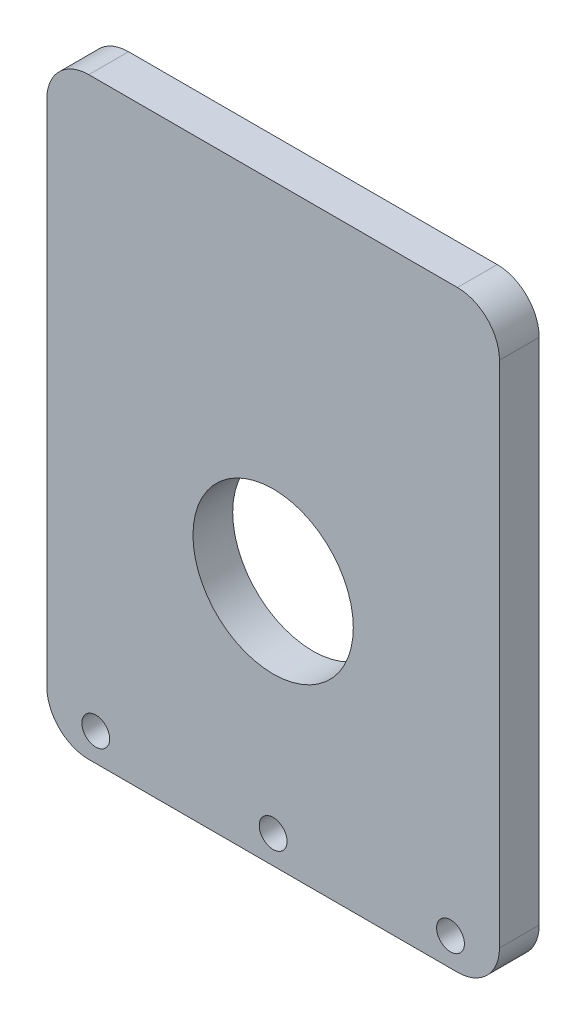
ISO-10303-21;
HEADER;
FILE_DESCRIPTION(('STEP AP214'),'2;1');
FILE_NAME('part.step','',(''),(''),'','','');
FILE_SCHEMA(('AUTOMOTIVE_DESIGN { 1 0 10303 214 1 1 1 1 }'));
ENDSEC;
DATA;
#1=APPLICATION_CONTEXT('core data for automotive mechanical design processes');
#2=APPLICATION_PROTOCOL_DEFINITION('international standard','automotive_design',2000,#1);
#3=PRODUCT_CONTEXT('',#1,'mechanical');
#4=PRODUCT('Part','Part','',(#3));
#5=PRODUCT_RELATED_PRODUCT_CATEGORY('part','',(#4));
#6=PRODUCT_DEFINITION_FORMATION('','',#4);
#7=PRODUCT_DEFINITION_CONTEXT('part definition',#1,'design');
#8=PRODUCT_DEFINITION('design','',#6,#7);
#9=PRODUCT_DEFINITION_SHAPE('','',#8);
#10=(LENGTH_UNIT() NAMED_UNIT(*) SI_UNIT(.MILLI.,.METRE.));
#11=(NAMED_UNIT(*) PLANE_ANGLE_UNIT() SI_UNIT($,.RADIAN.));
#12=(NAMED_UNIT(*) SI_UNIT($,.STERADIAN.) SOLID_ANGLE_UNIT());
#13=UNCERTAINTY_MEASURE_WITH_UNIT(LENGTH_MEASURE(1.E-05),#10,'distance_accuracy_value','');
#14=(GEOMETRIC_REPRESENTATION_CONTEXT(3) GLOBAL_UNCERTAINTY_ASSIGNED_CONTEXT((#13)) GLOBAL_UNIT_ASSIGNED_CONTEXT((#10,
#11,#12)) REPRESENTATION_CONTEXT('',''));
#15=CARTESIAN_POINT('',(0.,0.,0.));
#16=DIRECTION('',(0.,0.,1.));
#17=DIRECTION('',(1.,0.,0.));
#18=AXIS2_PLACEMENT_3D('',#15,#16,#17);
#19=CARTESIAN_POINT('',(-4909.25826633337,2111.96119744792,7.112));
#20=DIRECTION('',(0.,0.,1.));
#21=DIRECTION('',(1.,0.,0.));
#22=AXIS2_PLACEMENT_3D('',#19,#20,#21);
#23=PLANE('',#22);
#24=CARTESIAN_POINT('',(-4908.01366633337,2018.34949744792,7.112));
#25=DIRECTION('',(0.,0.,1.));
#26=DIRECTION('',(1.,0.,0.));
#27=AXIS2_PLACEMENT_3D('',#24,#25,#26);
#28=CIRCLE('',#27,2.4892000000003);
#29=CARTESIAN_POINT('',(-4905.52446633337,2018.34949744792,7.112));
#30=VERTEX_POINT('',#29);
#31=EDGE_CURVE('E189',#30,#30,#28,.T.);
#32=ORIENTED_EDGE('',*,*,#31,.F.);
#33=EDGE_LOOP('',(#32));
#34=FACE_BOUND('',#33,.T.);
#35=CARTESIAN_POINT('',(-4876.26366633337,2018.34949744792,7.112));
#36=DIRECTION('',(0.,0.,1.));
#37=DIRECTION('',(1.,0.,0.));
#38=AXIS2_PLACEMENT_3D('',#35,#36,#37);
#39=CIRCLE('',#38,2.4892000000003);
#40=CARTESIAN_POINT('',(-4873.77446633337,2018.34949744792,7.112));
#41=VERTEX_POINT('',#40);
#42=EDGE_CURVE('E135',#41,#41,#39,.T.);
#43=ORIENTED_EDGE('',*,*,#42,.F.);
#44=EDGE_LOOP('',(#43));
#45=FACE_BOUND('',#44,.T.);
#46=CARTESIAN_POINT('',(-4909.25826633337,2111.96119744792,7.112));
#47=DIRECTION('',(0.,0.,1.));
#48=DIRECTION('',(1.,0.,0.));
#49=AXIS2_PLACEMENT_3D('',#46,#47,#48);
#50=CIRCLE('',#49,7.5183999999997);
#51=CARTESIAN_POINT('',(-4909.25826633337,2119.47959744792,7.112));
#52=VERTEX_POINT('',#51);
#53=CARTESIAN_POINT('',(-4916.77666633337,2111.96119744792,7.112));
#54=VERTEX_POINT('',#53);
#55=EDGE_CURVE('E146',#52,#54,#50,.T.);
#56=ORIENTED_EDGE('',*,*,#55,.T.);
#57=DIRECTION('',(0.,-1.,0.));
#58=VECTOR('',#57,1.);
#59=CARTESIAN_POINT('',(-4916.77666633337,2111.96119744792,7.112));
#60=LINE('',#59,#58);
#61=CARTESIAN_POINT('',(-4916.77666633337,2020.83869744792,7.112));
#62=VERTEX_POINT('',#61);
#63=EDGE_CURVE('E94',#54,#62,#60,.T.);
#64=ORIENTED_EDGE('',*,*,#63,.T.);
#65=CARTESIAN_POINT('',(-4909.25826633337,2020.83869744792,7.112));
#66=DIRECTION('',(0.,0.,1.));
#67=DIRECTION('',(1.,0.,0.));
#68=AXIS2_PLACEMENT_3D('',#65,#66,#67);
#69=CIRCLE('',#68,7.51839999999948);
#70=CARTESIAN_POINT('',(-4909.25826633337,2013.32029744792,7.112));
#71=VERTEX_POINT('',#70);
#72=EDGE_CURVE('E161',#62,#71,#69,.T.);
#73=ORIENTED_EDGE('',*,*,#72,.T.);
#74=DIRECTION('',(1.,0.,0.));
#75=VECTOR('',#74,1.);
#76=CARTESIAN_POINT('',(-4843.26906633337,2013.32029744792,7.112));
#77=LINE('',#76,#75);
#78=CARTESIAN_POINT('',(-4843.26906633337,2013.32029744792,7.112));
#79=VERTEX_POINT('',#78);
#80=EDGE_CURVE('E174',#71,#79,#77,.T.);
#81=ORIENTED_EDGE('',*,*,#80,.T.);
#82=CARTESIAN_POINT('',(-4843.26906633337,2020.83869744792,7.112));
#83=DIRECTION('',(0.,0.,1.));
#84=DIRECTION('',(1.,0.,0.));
#85=AXIS2_PLACEMENT_3D('',#82,#83,#84);
#86=CIRCLE('',#85,7.51839999999948);
#87=CARTESIAN_POINT('',(-4835.75066633337,2020.83869744792,7.112));
#88=VERTEX_POINT('',#87);
#89=EDGE_CURVE('E113',#79,#88,#86,.T.);
#90=ORIENTED_EDGE('',*,*,#89,.T.);
#91=DIRECTION('',(0.,1.,0.));
#92=VECTOR('',#91,1.);
#93=CARTESIAN_POINT('',(-4835.75066633337,2111.96119744792,7.112));
#94=LINE('',#93,#92);
#95=CARTESIAN_POINT('',(-4835.75066633337,2111.96119744792,7.112));
#96=VERTEX_POINT('',#95);
#97=EDGE_CURVE('E107',#88,#96,#94,.T.);
#98=ORIENTED_EDGE('',*,*,#97,.T.);
#99=CARTESIAN_POINT('',(-4843.26906633337,2111.96119744792,7.112));
#100=DIRECTION('',(0.,0.,1.));
#101=DIRECTION('',(1.,0.,0.));
#102=AXIS2_PLACEMENT_3D('',#99,#100,#101);
#103=CIRCLE('',#102,7.5183999999997);
#104=CARTESIAN_POINT('',(-4843.26906633337,2119.47959744792,7.112));
#105=VERTEX_POINT('',#104);
#106=EDGE_CURVE('E111',#96,#105,#103,.T.);
#107=ORIENTED_EDGE('',*,*,#106,.T.);
#108=DIRECTION('',(-1.,0.,0.));
#109=VECTOR('',#108,1.);
#110=CARTESIAN_POINT('',(-4909.25826633337,2119.47959744792,7.112));
#111=LINE('',#110,#109);
#112=EDGE_CURVE('E51',#105,#52,#111,.T.);
#113=ORIENTED_EDGE('',*,*,#112,.T.);
#114=EDGE_LOOP('',(#56,#64,#73,#81,#90,#98,#107,#113));
#115=FACE_BOUND('',#114,.T.);
#116=CARTESIAN_POINT('',(-4844.51366633337,2018.34949744792,7.112));
#117=DIRECTION('',(0.,0.,1.));
#118=DIRECTION('',(1.,0.,0.));
#119=AXIS2_PLACEMENT_3D('',#116,#117,#118);
#120=CIRCLE('',#119,2.4892000000003);
#121=CARTESIAN_POINT('',(-4842.02446633337,2018.34949744792,7.112));
#122=VERTEX_POINT('',#121);
#123=EDGE_CURVE('E183',#122,#122,#120,.T.);
#124=ORIENTED_EDGE('',*,*,#123,.F.);
#125=EDGE_LOOP('',(#124));
#126=FACE_BOUND('',#125,.T.);
#127=CARTESIAN_POINT('',(-4876.26366633337,2057.41469744792,7.112));
#128=DIRECTION('',(0.,0.,1.));
#129=DIRECTION('',(1.,0.,0.));
#130=AXIS2_PLACEMENT_3D('',#127,#128,#129);
#131=CIRCLE('',#130,14.3509999999996);
#132=CARTESIAN_POINT('',(-4861.91266633337,2057.41469744792,7.112));
#133=VERTEX_POINT('',#132);
#134=EDGE_CURVE('E195',#133,#133,#131,.T.);
#135=ORIENTED_EDGE('',*,*,#134,.F.);
#136=EDGE_LOOP('',(#135));
#137=FACE_BOUND('',#136,.T.);
#138=ADVANCED_FACE('F34',(#34,#45,#115,#126,#137),#23,.T.);
#139=CARTESIAN_POINT('',(-4909.25826633337,2111.96119744792,0.));
#140=DIRECTION('',(0.,0.,1.));
#141=DIRECTION('',(1.,0.,0.));
#142=AXIS2_PLACEMENT_3D('',#139,#140,#141);
#143=PLANE('',#142);
#144=CARTESIAN_POINT('',(-4908.01366633337,2018.34949744792,0.));
#145=DIRECTION('',(0.,0.,1.));
#146=DIRECTION('',(1.,0.,0.));
#147=AXIS2_PLACEMENT_3D('',#144,#145,#146);
#148=CIRCLE('',#147,2.4892000000003);
#149=CARTESIAN_POINT('',(-4905.52446633337,2018.34949744792,0.));
#150=VERTEX_POINT('',#149);
#151=EDGE_CURVE('E192',#150,#150,#148,.T.);
#152=ORIENTED_EDGE('',*,*,#151,.T.);
#153=EDGE_LOOP('',(#152));
#154=FACE_BOUND('',#153,.T.);
#155=CARTESIAN_POINT('',(-4876.26366633337,2018.34949744792,0.));
#156=DIRECTION('',(0.,0.,1.));
#157=DIRECTION('',(1.,0.,0.));
#158=AXIS2_PLACEMENT_3D('',#155,#156,#157);
#159=CIRCLE('',#158,2.4892000000003);
#160=CARTESIAN_POINT('',(-4873.77446633337,2018.34949744792,0.));
#161=VERTEX_POINT('',#160);
#162=EDGE_CURVE('E180',#161,#161,#159,.T.);
#163=ORIENTED_EDGE('',*,*,#162,.T.);
#164=EDGE_LOOP('',(#163));
#165=FACE_BOUND('',#164,.T.);
#166=CARTESIAN_POINT('',(-4909.25826633337,2111.96119744792,0.));
#167=DIRECTION('',(0.,0.,1.));
#168=DIRECTION('',(1.,0.,0.));
#169=AXIS2_PLACEMENT_3D('',#166,#167,#168);
#170=CIRCLE('',#169,7.5183999999997);
#171=CARTESIAN_POINT('',(-4909.25826633337,2119.47959744792,0.));
#172=VERTEX_POINT('',#171);
#173=CARTESIAN_POINT('',(-4916.77666633337,2111.96119744792,0.));
#174=VERTEX_POINT('',#173);
#175=EDGE_CURVE('E131',#172,#174,#170,.T.);
#176=ORIENTED_EDGE('',*,*,#175,.F.);
#177=DIRECTION('',(-1.,0.,0.));
#178=VECTOR('',#177,1.);
#179=CARTESIAN_POINT('',(-4909.25826633337,2119.47959744792,0.));
#180=LINE('',#179,#178);
#181=CARTESIAN_POINT('',(-4843.26906633337,2119.47959744792,0.));
#182=VERTEX_POINT('',#181);
#183=EDGE_CURVE('E86',#182,#172,#180,.T.);
#184=ORIENTED_EDGE('',*,*,#183,.F.);
#185=CARTESIAN_POINT('',(-4843.26906633337,2111.96119744792,0.));
#186=DIRECTION('',(0.,0.,1.));
#187=DIRECTION('',(1.,0.,0.));
#188=AXIS2_PLACEMENT_3D('',#185,#186,#187);
#189=CIRCLE('',#188,7.5183999999997);
#190=CARTESIAN_POINT('',(-4835.75066633337,2111.96119744792,0.));
#191=VERTEX_POINT('',#190);
#192=EDGE_CURVE('E80',#191,#182,#189,.T.);
#193=ORIENTED_EDGE('',*,*,#192,.F.);
#194=DIRECTION('',(0.,1.,0.));
#195=VECTOR('',#194,1.);
#196=CARTESIAN_POINT('',(-4835.75066633337,2111.96119744792,0.));
#197=LINE('',#196,#195);
#198=CARTESIAN_POINT('',(-4835.75066633337,2020.83869744792,0.));
#199=VERTEX_POINT('',#198);
#200=EDGE_CURVE('E121',#199,#191,#197,.T.);
#201=ORIENTED_EDGE('',*,*,#200,.F.);
#202=CARTESIAN_POINT('',(-4843.26906633337,2020.83869744792,0.));
#203=DIRECTION('',(0.,0.,1.));
#204=DIRECTION('',(1.,0.,0.));
#205=AXIS2_PLACEMENT_3D('',#202,#203,#204);
#206=CIRCLE('',#205,7.51839999999948);
#207=CARTESIAN_POINT('',(-4843.26906633337,2013.32029744792,0.));
#208=VERTEX_POINT('',#207);
#209=EDGE_CURVE('E141',#208,#199,#206,.T.);
#210=ORIENTED_EDGE('',*,*,#209,.F.);
#211=DIRECTION('',(1.,0.,0.));
#212=VECTOR('',#211,1.);
#213=CARTESIAN_POINT('',(-4843.26906633337,2013.32029744792,0.));
#214=LINE('',#213,#212);
#215=CARTESIAN_POINT('',(-4909.25826633337,2013.32029744792,0.));
#216=VERTEX_POINT('',#215);
#217=EDGE_CURVE('E139',#216,#208,#214,.T.);
#218=ORIENTED_EDGE('',*,*,#217,.F.);
#219=CARTESIAN_POINT('',(-4909.25826633337,2020.83869744792,0.));
#220=DIRECTION('',(0.,0.,1.));
#221=DIRECTION('',(1.,0.,0.));
#222=AXIS2_PLACEMENT_3D('',#219,#220,#221);
#223=CIRCLE('',#222,7.51839999999948);
#224=CARTESIAN_POINT('',(-4916.77666633337,2020.83869744792,0.));
#225=VERTEX_POINT('',#224);
#226=EDGE_CURVE('E137',#225,#216,#223,.T.);
#227=ORIENTED_EDGE('',*,*,#226,.F.);
#228=DIRECTION('',(0.,-1.,0.));
#229=VECTOR('',#228,1.);
#230=CARTESIAN_POINT('',(-4916.77666633337,2111.96119744792,0.));
#231=LINE('',#230,#229);
#232=EDGE_CURVE('E134',#174,#225,#231,.T.);
#233=ORIENTED_EDGE('',*,*,#232,.F.);
#234=EDGE_LOOP('',(#176,#184,#193,#201,#210,#218,#227,#233));
#235=FACE_BOUND('',#234,.T.);
#236=CARTESIAN_POINT('',(-4844.51366633337,2018.34949744792,0.));
#237=DIRECTION('',(0.,0.,1.));
#238=DIRECTION('',(1.,0.,0.));
#239=AXIS2_PLACEMENT_3D('',#236,#237,#238);
#240=CIRCLE('',#239,2.4892000000003);
#241=CARTESIAN_POINT('',(-4842.02446633337,2018.34949744792,0.));
#242=VERTEX_POINT('',#241);
#243=EDGE_CURVE('E186',#242,#242,#240,.T.);
#244=ORIENTED_EDGE('',*,*,#243,.T.);
#245=EDGE_LOOP('',(#244));
#246=FACE_BOUND('',#245,.T.);
#247=CARTESIAN_POINT('',(-4876.26366633337,2057.41469744792,0.));
#248=DIRECTION('',(0.,0.,1.));
#249=DIRECTION('',(1.,0.,0.));
#250=AXIS2_PLACEMENT_3D('',#247,#248,#249);
#251=CIRCLE('',#250,14.3509999999996);
#252=CARTESIAN_POINT('',(-4861.91266633337,2057.41469744792,0.));
#253=VERTEX_POINT('',#252);
#254=EDGE_CURVE('E198',#253,#253,#251,.T.);
#255=ORIENTED_EDGE('',*,*,#254,.T.);
#256=EDGE_LOOP('',(#255));
#257=FACE_BOUND('',#256,.T.);
#258=ADVANCED_FACE('F165',(#154,#165,#235,#246,#257),#143,.F.);
#259=CARTESIAN_POINT('',(-4909.25826633337,2111.96119744792,7.112));
#260=DIRECTION('',(0.,0.,-1.));
#261=DIRECTION('',(-1.,0.,0.));
#262=AXIS2_PLACEMENT_3D('',#259,#260,#261);
#263=CYLINDRICAL_SURFACE('',#262,7.5183999999997);
#264=ORIENTED_EDGE('',*,*,#175,.T.);
#265=DIRECTION('',(0.,0.,-1.));
#266=VECTOR('',#265,1.);
#267=CARTESIAN_POINT('',(-4916.77666633337,2111.96119744792,7.112));
#268=LINE('',#267,#266);
#269=EDGE_CURVE('E11',#54,#174,#268,.T.);
#270=ORIENTED_EDGE('',*,*,#269,.F.);
#271=ORIENTED_EDGE('',*,*,#55,.F.);
#272=DIRECTION('',(0.,0.,-1.));
#273=VECTOR('',#272,1.);
#274=CARTESIAN_POINT('',(-4909.25826633337,2119.47959744792,7.112));
#275=LINE('',#274,#273);
#276=EDGE_CURVE('E127',#52,#172,#275,.T.);
#277=ORIENTED_EDGE('',*,*,#276,.T.);
#278=EDGE_LOOP('',(#264,#270,#271,#277));
#279=FACE_BOUND('',#278,.T.);
#280=ADVANCED_FACE('F36',(#279),#263,.T.);
#281=CARTESIAN_POINT('',(-4916.77666633337,2111.96119744792,7.112));
#282=DIRECTION('',(1.,0.,0.));
#283=DIRECTION('',(0.,1.,0.));
#284=AXIS2_PLACEMENT_3D('',#281,#282,#283);
#285=PLANE('',#284);
#286=ORIENTED_EDGE('',*,*,#232,.T.);
#287=DIRECTION('',(0.,0.,-1.));
#288=VECTOR('',#287,1.);
#289=CARTESIAN_POINT('',(-4916.77666633337,2020.83869744792,7.112));
#290=LINE('',#289,#288);
#291=EDGE_CURVE('E43',#62,#225,#290,.T.);
#292=ORIENTED_EDGE('',*,*,#291,.F.);
#293=ORIENTED_EDGE('',*,*,#63,.F.);
#294=ORIENTED_EDGE('',*,*,#269,.T.);
#295=EDGE_LOOP('',(#286,#292,#293,#294));
#296=FACE_BOUND('',#295,.T.);
#297=ADVANCED_FACE('F233',(#296),#285,.F.);
#298=CARTESIAN_POINT('',(-4909.25826633337,2020.83869744792,7.112));
#299=DIRECTION('',(0.,0.,-1.));
#300=DIRECTION('',(-1.,0.,0.));
#301=AXIS2_PLACEMENT_3D('',#298,#299,#300);
#302=CYLINDRICAL_SURFACE('',#301,7.51839999999948);
#303=ORIENTED_EDGE('',*,*,#226,.T.);
#304=DIRECTION('',(0.,0.,-1.));
#305=VECTOR('',#304,1.);
#306=CARTESIAN_POINT('',(-4909.25826633337,2013.32029744792,7.112));
#307=LINE('',#306,#305);
#308=EDGE_CURVE('E153',#71,#216,#307,.T.);
#309=ORIENTED_EDGE('',*,*,#308,.F.);
#310=ORIENTED_EDGE('',*,*,#72,.F.);
#311=ORIENTED_EDGE('',*,*,#291,.T.);
#312=EDGE_LOOP('',(#303,#309,#310,#311));
#313=FACE_BOUND('',#312,.T.);
#314=ADVANCED_FACE('F159',(#313),#302,.T.);
#315=CARTESIAN_POINT('',(-4843.26906633337,2013.32029744792,7.112));
#316=DIRECTION('',(0.,1.,0.));
#317=DIRECTION('',(-1.,0.,0.));
#318=AXIS2_PLACEMENT_3D('',#315,#316,#317);
#319=PLANE('',#318);
#320=ORIENTED_EDGE('',*,*,#217,.T.);
#321=DIRECTION('',(0.,0.,-1.));
#322=VECTOR('',#321,1.);
#323=CARTESIAN_POINT('',(-4843.26906633337,2013.32029744792,7.112));
#324=LINE('',#323,#322);
#325=EDGE_CURVE('E150',#79,#208,#324,.T.);
#326=ORIENTED_EDGE('',*,*,#325,.F.);
#327=ORIENTED_EDGE('',*,*,#80,.F.);
#328=ORIENTED_EDGE('',*,*,#308,.T.);
#329=EDGE_LOOP('',(#320,#326,#327,#328));
#330=FACE_BOUND('',#329,.T.);
#331=ADVANCED_FACE('F170',(#330),#319,.F.);
#332=CARTESIAN_POINT('',(-4843.26906633337,2020.83869744792,7.112));
#333=DIRECTION('',(0.,0.,-1.));
#334=DIRECTION('',(-1.,0.,0.));
#335=AXIS2_PLACEMENT_3D('',#332,#333,#334);
#336=CYLINDRICAL_SURFACE('',#335,7.51839999999948);
#337=ORIENTED_EDGE('',*,*,#209,.T.);
#338=DIRECTION('',(0.,0.,-1.));
#339=VECTOR('',#338,1.);
#340=CARTESIAN_POINT('',(-4835.75066633337,2020.83869744792,7.112));
#341=LINE('',#340,#339);
#342=EDGE_CURVE('E122',#88,#199,#341,.T.);
#343=ORIENTED_EDGE('',*,*,#342,.F.);
#344=ORIENTED_EDGE('',*,*,#89,.F.);
#345=ORIENTED_EDGE('',*,*,#325,.T.);
#346=EDGE_LOOP('',(#337,#343,#344,#345));
#347=FACE_BOUND('',#346,.T.);
#348=ADVANCED_FACE('F173',(#347),#336,.T.);
#349=CARTESIAN_POINT('',(-4835.75066633337,2111.96119744792,7.112));
#350=DIRECTION('',(-1.,0.,0.));
#351=DIRECTION('',(0.,0.,1.));
#352=AXIS2_PLACEMENT_3D('',#349,#350,#351);
#353=PLANE('',#352);
#354=ORIENTED_EDGE('',*,*,#200,.T.);
#355=DIRECTION('',(0.,0.,-1.));
#356=VECTOR('',#355,1.);
#357=CARTESIAN_POINT('',(-4835.75066633337,2111.96119744792,7.112));
#358=LINE('',#357,#356);
#359=EDGE_CURVE('E118',#96,#191,#358,.T.);
#360=ORIENTED_EDGE('',*,*,#359,.F.);
#361=ORIENTED_EDGE('',*,*,#97,.F.);
#362=ORIENTED_EDGE('',*,*,#342,.T.);
#363=EDGE_LOOP('',(#354,#360,#361,#362));
#364=FACE_BOUND('',#363,.T.);
#365=ADVANCED_FACE('F119',(#364),#353,.F.);
#366=CARTESIAN_POINT('',(-4843.26906633337,2111.96119744792,7.112));
#367=DIRECTION('',(0.,0.,-1.));
#368=DIRECTION('',(-1.,0.,0.));
#369=AXIS2_PLACEMENT_3D('',#366,#367,#368);
#370=CYLINDRICAL_SURFACE('',#369,7.5183999999997);
#371=ORIENTED_EDGE('',*,*,#192,.T.);
#372=DIRECTION('',(0.,0.,-1.));
#373=VECTOR('',#372,1.);
#374=CARTESIAN_POINT('',(-4843.26906633337,2119.47959744792,7.112));
#375=LINE('',#374,#373);
#376=EDGE_CURVE('E123',#105,#182,#375,.T.);
#377=ORIENTED_EDGE('',*,*,#376,.F.);
#378=ORIENTED_EDGE('',*,*,#106,.F.);
#379=ORIENTED_EDGE('',*,*,#359,.T.);
#380=EDGE_LOOP('',(#371,#377,#378,#379));
#381=FACE_BOUND('',#380,.T.);
#382=ADVANCED_FACE('F125',(#381),#370,.T.);
#383=CARTESIAN_POINT('',(-4909.25826633337,2119.47959744792,7.112));
#384=DIRECTION('',(0.,-1.,0.));
#385=DIRECTION('',(1.,0.,0.));
#386=AXIS2_PLACEMENT_3D('',#383,#384,#385);
#387=PLANE('',#386);
#388=ORIENTED_EDGE('',*,*,#183,.T.);
#389=ORIENTED_EDGE('',*,*,#276,.F.);
#390=ORIENTED_EDGE('',*,*,#112,.F.);
#391=ORIENTED_EDGE('',*,*,#376,.T.);
#392=EDGE_LOOP('',(#388,#389,#390,#391));
#393=FACE_BOUND('',#392,.T.);
#394=ADVANCED_FACE('F221',(#393),#387,.F.);
#395=CARTESIAN_POINT('',(-4876.26366633337,2018.34949744792,7.112));
#396=DIRECTION('',(0.,0.,-1.));
#397=DIRECTION('',(-1.,0.,0.));
#398=AXIS2_PLACEMENT_3D('',#395,#396,#397);
#399=CYLINDRICAL_SURFACE('',#398,2.4892000000003);
#400=ORIENTED_EDGE('',*,*,#42,.T.);
#401=EDGE_LOOP('',(#400));
#402=FACE_BOUND('',#401,.T.);
#403=ORIENTED_EDGE('',*,*,#162,.F.);
#404=EDGE_LOOP('',(#403));
#405=FACE_BOUND('',#404,.T.);
#406=ADVANCED_FACE('F218',(#402,#405),#399,.F.);
#407=CARTESIAN_POINT('',(-4844.51366633337,2018.34949744792,7.112));
#408=DIRECTION('',(0.,0.,-1.));
#409=DIRECTION('',(-1.,0.,0.));
#410=AXIS2_PLACEMENT_3D('',#407,#408,#409);
#411=CYLINDRICAL_SURFACE('',#410,2.4892000000003);
#412=ORIENTED_EDGE('',*,*,#123,.T.);
#413=EDGE_LOOP('',(#412));
#414=FACE_BOUND('',#413,.T.);
#415=ORIENTED_EDGE('',*,*,#243,.F.);
#416=EDGE_LOOP('',(#415));
#417=FACE_BOUND('',#416,.T.);
#418=ADVANCED_FACE('F299',(#414,#417),#411,.F.);
#419=CARTESIAN_POINT('',(-4908.01366633337,2018.34949744792,7.112));
#420=DIRECTION('',(0.,0.,-1.));
#421=DIRECTION('',(-1.,0.,0.));
#422=AXIS2_PLACEMENT_3D('',#419,#420,#421);
#423=CYLINDRICAL_SURFACE('',#422,2.4892000000003);
#424=ORIENTED_EDGE('',*,*,#31,.T.);
#425=EDGE_LOOP('',(#424));
#426=FACE_BOUND('',#425,.T.);
#427=ORIENTED_EDGE('',*,*,#151,.F.);
#428=EDGE_LOOP('',(#427));
#429=FACE_BOUND('',#428,.T.);
#430=ADVANCED_FACE('F307',(#426,#429),#423,.F.);
#431=CARTESIAN_POINT('',(-4876.26366633337,2057.41469744792,7.112));
#432=DIRECTION('',(0.,0.,-1.));
#433=DIRECTION('',(-1.,0.,0.));
#434=AXIS2_PLACEMENT_3D('',#431,#432,#433);
#435=CYLINDRICAL_SURFACE('',#434,14.3509999999996);
#436=ORIENTED_EDGE('',*,*,#134,.T.);
#437=EDGE_LOOP('',(#436));
#438=FACE_BOUND('',#437,.T.);
#439=ORIENTED_EDGE('',*,*,#254,.F.);
#440=EDGE_LOOP('',(#439));
#441=FACE_BOUND('',#440,.T.);
#442=ADVANCED_FACE('F204',(#438,#441),#435,.F.);
#443=CLOSED_SHELL('',(#138,#258,#280,#297,#314,#331,#348,#365,#382,#394,#406,#418,#430,#442));
#444=MANIFOLD_SOLID_BREP('B2',#443);
#445=ADVANCED_BREP_SHAPE_REPRESENTATION('',(#18,#444),#14);
#446=SHAPE_DEFINITION_REPRESENTATION(#9,#445);
ENDSEC;
END-ISO-10303-21;
